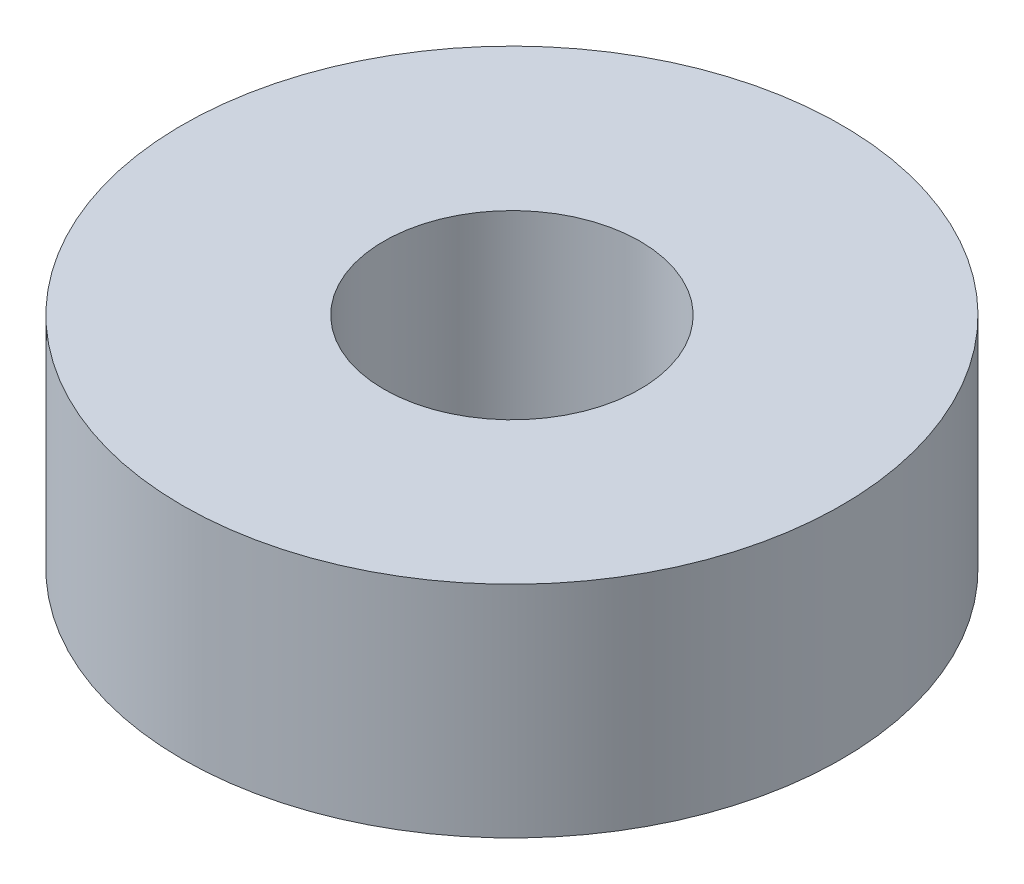
ISO-10303-21;
HEADER;
FILE_DESCRIPTION(('STEP AP214'),'2;1');
FILE_NAME('part.step','',(''),(''),'','','');
FILE_SCHEMA(('AUTOMOTIVE_DESIGN { 1 0 10303 214 1 1 1 1 }'));
ENDSEC;
DATA;
#1=APPLICATION_CONTEXT('core data for automotive mechanical design processes');
#2=APPLICATION_PROTOCOL_DEFINITION('international standard','automotive_design',2000,#1);
#3=PRODUCT_CONTEXT('',#1,'mechanical');
#4=PRODUCT('Part','Part','',(#3));
#5=PRODUCT_RELATED_PRODUCT_CATEGORY('part','',(#4));
#6=PRODUCT_DEFINITION_FORMATION('','',#4);
#7=PRODUCT_DEFINITION_CONTEXT('part definition',#1,'design');
#8=PRODUCT_DEFINITION('design','',#6,#7);
#9=PRODUCT_DEFINITION_SHAPE('','',#8);
#10=(LENGTH_UNIT() NAMED_UNIT(*) SI_UNIT(.MILLI.,.METRE.));
#11=(NAMED_UNIT(*) PLANE_ANGLE_UNIT() SI_UNIT($,.RADIAN.));
#12=(NAMED_UNIT(*) SI_UNIT($,.STERADIAN.) SOLID_ANGLE_UNIT());
#13=UNCERTAINTY_MEASURE_WITH_UNIT(LENGTH_MEASURE(1.E-05),#10,'distance_accuracy_value','');
#14=(GEOMETRIC_REPRESENTATION_CONTEXT(3) GLOBAL_UNCERTAINTY_ASSIGNED_CONTEXT((#13)) GLOBAL_UNIT_ASSIGNED_CONTEXT((#10,
#11,#12)) REPRESENTATION_CONTEXT('',''));
#15=CARTESIAN_POINT('',(0.,0.,0.));
#16=DIRECTION('',(0.,0.,1.));
#17=DIRECTION('',(1.,0.,0.));
#18=AXIS2_PLACEMENT_3D('',#15,#16,#17);
#19=CARTESIAN_POINT('',(0.,6.,2.29369501586342));
#20=DIRECTION('',(0.,1.,0.));
#21=DIRECTION('',(0.,0.,1.));
#22=AXIS2_PLACEMENT_3D('',#19,#20,#21);
#23=PLANE('',#22);
#24=CARTESIAN_POINT('',(0.,6.,2.29369501586342));
#25=DIRECTION('',(0.,1.,0.));
#26=DIRECTION('',(0.,0.,1.));
#27=AXIS2_PLACEMENT_3D('',#24,#25,#26);
#28=CIRCLE('',#27,9.);
#29=CARTESIAN_POINT('',(0.,6.,11.2936950158634));
#30=VERTEX_POINT('',#29);
#31=EDGE_CURVE('E10',#30,#30,#28,.T.);
#32=ORIENTED_EDGE('',*,*,#31,.T.);
#33=EDGE_LOOP('',(#32));
#34=FACE_BOUND('',#33,.T.);
#35=CARTESIAN_POINT('',(0.,6.,2.29369501586342));
#36=DIRECTION('',(0.,1.,0.));
#37=DIRECTION('',(0.,0.,1.));
#38=AXIS2_PLACEMENT_3D('',#35,#36,#37);
#39=CIRCLE('',#38,3.5);
#40=CARTESIAN_POINT('',(0.,6.,5.79369501586342));
#41=VERTEX_POINT('',#40);
#42=EDGE_CURVE('E40',#41,#41,#39,.T.);
#43=ORIENTED_EDGE('',*,*,#42,.F.);
#44=EDGE_LOOP('',(#43));
#45=FACE_BOUND('',#44,.T.);
#46=ADVANCED_FACE('F29',(#34,#45),#23,.T.);
#47=CARTESIAN_POINT('',(0.,0.,2.29369501586342));
#48=DIRECTION('',(0.,1.,0.));
#49=DIRECTION('',(0.,0.,1.));
#50=AXIS2_PLACEMENT_3D('',#47,#48,#49);
#51=PLANE('',#50);
#52=CARTESIAN_POINT('',(0.,0.,2.29369501586342));
#53=DIRECTION('',(0.,1.,0.));
#54=DIRECTION('',(0.,0.,1.));
#55=AXIS2_PLACEMENT_3D('',#52,#53,#54);
#56=CIRCLE('',#55,9.);
#57=CARTESIAN_POINT('',(0.,0.,11.2936950158634));
#58=VERTEX_POINT('',#57);
#59=EDGE_CURVE('E33',#58,#58,#56,.T.);
#60=ORIENTED_EDGE('',*,*,#59,.F.);
#61=EDGE_LOOP('',(#60));
#62=FACE_BOUND('',#61,.T.);
#63=CARTESIAN_POINT('',(0.,0.,2.29369501586342));
#64=DIRECTION('',(0.,1.,0.));
#65=DIRECTION('',(0.,0.,1.));
#66=AXIS2_PLACEMENT_3D('',#63,#64,#65);
#67=CIRCLE('',#66,3.5);
#68=CARTESIAN_POINT('',(0.,0.,5.79369501586342));
#69=VERTEX_POINT('',#68);
#70=EDGE_CURVE('E42',#69,#69,#67,.T.);
#71=ORIENTED_EDGE('',*,*,#70,.T.);
#72=EDGE_LOOP('',(#71));
#73=FACE_BOUND('',#72,.T.);
#74=ADVANCED_FACE('F52',(#62,#73),#51,.F.);
#75=CARTESIAN_POINT('',(0.,6.,2.29369501586342));
#76=DIRECTION('',(0.,-1.,0.));
#77=DIRECTION('',(0.,0.,-1.));
#78=AXIS2_PLACEMENT_3D('',#75,#76,#77);
#79=CYLINDRICAL_SURFACE('',#78,9.);
#80=ORIENTED_EDGE('',*,*,#31,.F.);
#81=EDGE_LOOP('',(#80));
#82=FACE_BOUND('',#81,.T.);
#83=ORIENTED_EDGE('',*,*,#59,.T.);
#84=EDGE_LOOP('',(#83));
#85=FACE_BOUND('',#84,.T.);
#86=ADVANCED_FACE('F31',(#82,#85),#79,.T.);
#87=CARTESIAN_POINT('',(0.,6.,2.29369501586342));
#88=DIRECTION('',(0.,-1.,0.));
#89=DIRECTION('',(0.,0.,-1.));
#90=AXIS2_PLACEMENT_3D('',#87,#88,#89);
#91=CYLINDRICAL_SURFACE('',#90,3.5);
#92=ORIENTED_EDGE('',*,*,#42,.T.);
#93=EDGE_LOOP('',(#92));
#94=FACE_BOUND('',#93,.T.);
#95=ORIENTED_EDGE('',*,*,#70,.F.);
#96=EDGE_LOOP('',(#95));
#97=FACE_BOUND('',#96,.T.);
#98=ADVANCED_FACE('F48',(#94,#97),#91,.F.);
#99=CLOSED_SHELL('',(#46,#74,#86,#98));
#100=MANIFOLD_SOLID_BREP('B2',#99);
#101=ADVANCED_BREP_SHAPE_REPRESENTATION('',(#18,#100),#14);
#102=SHAPE_DEFINITION_REPRESENTATION(#9,#101);
ENDSEC;
END-ISO-10303-21;
